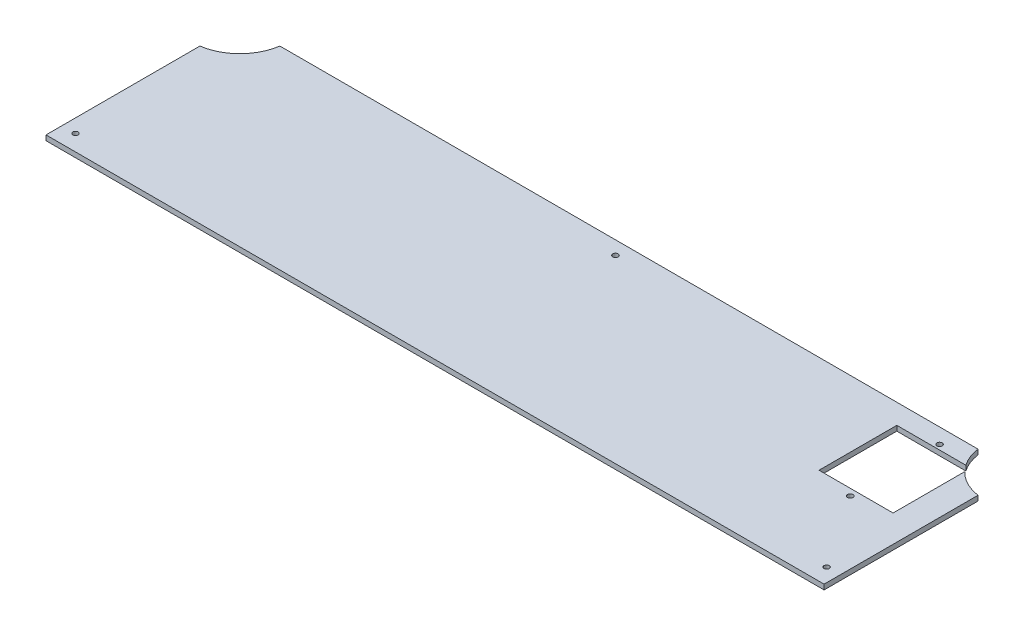
ISO-10303-21;
HEADER;
FILE_DESCRIPTION(('STEP AP214'),'2;1');
FILE_NAME('part.step','',(''),(''),'','','');
FILE_SCHEMA(('AUTOMOTIVE_DESIGN { 1 0 10303 214 1 1 1 1 }'));
ENDSEC;
DATA;
#1=APPLICATION_CONTEXT('core data for automotive mechanical design processes');
#2=APPLICATION_PROTOCOL_DEFINITION('international standard','automotive_design',2000,#1);
#3=PRODUCT_CONTEXT('',#1,'mechanical');
#4=PRODUCT('Part','Part','',(#3));
#5=PRODUCT_RELATED_PRODUCT_CATEGORY('part','',(#4));
#6=PRODUCT_DEFINITION_FORMATION('','',#4);
#7=PRODUCT_DEFINITION_CONTEXT('part definition',#1,'design');
#8=PRODUCT_DEFINITION('design','',#6,#7);
#9=PRODUCT_DEFINITION_SHAPE('','',#8);
#10=(LENGTH_UNIT() NAMED_UNIT(*) SI_UNIT(.MILLI.,.METRE.));
#11=(NAMED_UNIT(*) PLANE_ANGLE_UNIT() SI_UNIT($,.RADIAN.));
#12=(NAMED_UNIT(*) SI_UNIT($,.STERADIAN.) SOLID_ANGLE_UNIT());
#13=UNCERTAINTY_MEASURE_WITH_UNIT(LENGTH_MEASURE(1.E-05),#10,'distance_accuracy_value','');
#14=(GEOMETRIC_REPRESENTATION_CONTEXT(3) GLOBAL_UNCERTAINTY_ASSIGNED_CONTEXT((#13)) GLOBAL_UNIT_ASSIGNED_CONTEXT((#10,
#11,#12)) REPRESENTATION_CONTEXT('',''));
#15=CARTESIAN_POINT('',(0.,0.,0.));
#16=DIRECTION('',(0.,0.,1.));
#17=DIRECTION('',(1.,0.,0.));
#18=AXIS2_PLACEMENT_3D('',#15,#16,#17);
#19=CARTESIAN_POINT('',(-234.652456802082,3.,-62.0635647640357));
#20=DIRECTION('',(0.,1.,0.));
#21=DIRECTION('',(0.,0.,1.));
#22=AXIS2_PLACEMENT_3D('',#19,#20,#21);
#23=PLANE('',#22);
#24=CARTESIAN_POINT('',(0.097543197917882,3.,-50.0635647640358));
#25=DIRECTION('',(0.,1.,0.));
#26=DIRECTION('',(0.,0.,1.));
#27=AXIS2_PLACEMENT_3D('',#24,#25,#26);
#28=CIRCLE('',#27,1.59999999999999);
#29=CARTESIAN_POINT('',(0.097543197917882,3.,-48.4635647640358));
#30=VERTEX_POINT('',#29);
#31=EDGE_CURVE('E413',#30,#30,#28,.T.);
#32=ORIENTED_EDGE('',*,*,#31,.F.);
#33=EDGE_LOOP('',(#32));
#34=FACE_BOUND('',#33,.T.);
#35=CARTESIAN_POINT('',(193.347543197918,3.,-49.0635647640357));
#36=DIRECTION('',(0.,1.,0.));
#37=DIRECTION('',(0.,0.,1.));
#38=AXIS2_PLACEMENT_3D('',#35,#36,#37);
#39=CIRCLE('',#38,1.59999999999996);
#40=CARTESIAN_POINT('',(193.347543197918,3.,-47.4635647640358));
#41=VERTEX_POINT('',#40);
#42=EDGE_CURVE('E425',#41,#41,#39,.T.);
#43=ORIENTED_EDGE('',*,*,#42,.F.);
#44=EDGE_LOOP('',(#43));
#45=FACE_BOUND('',#44,.T.);
#46=DIRECTION('',(0.,0.,-1.));
#47=VECTOR('',#46,1.);
#48=CARTESIAN_POINT('',(230.847543197918,3.,52.6811268702657));
#49=LINE('',#48,#47);
#50=CARTESIAN_POINT('',(230.847543197918,3.,56.9364352359643));
#51=VERTEX_POINT('',#50);
#52=CARTESIAN_POINT('',(230.847543197918,3.,-34.3507518429337));
#53=VERTEX_POINT('',#52);
#54=EDGE_CURVE('E100',#51,#53,#49,.T.);
#55=ORIENTED_EDGE('',*,*,#54,.T.);
#56=CARTESIAN_POINT('',(234.847543197918,3.,-62.0635647640357));
#57=DIRECTION('',(0.,-1.,0.));
#58=DIRECTION('',(0.,0.,1.));
#59=AXIS2_PLACEMENT_3D('',#56,#57,#58);
#60=CIRCLE('',#59,28.);
#61=CARTESIAN_POINT('',(214.772071499805,3.,-42.5449727016391));
#62=VERTEX_POINT('',#61);
#63=EDGE_CURVE('E231',#53,#62,#60,.T.);
#64=ORIENTED_EDGE('',*,*,#63,.T.);
#65=DIRECTION('',(0.,0.,1.));
#66=VECTOR('',#65,1.);
#67=CARTESIAN_POINT('',(214.772071499805,3.,-0.0635647640357256));
#68=LINE('',#67,#66);
#69=CARTESIAN_POINT('',(214.772071499805,3.,-0.0635647640357256));
#70=VERTEX_POINT('',#69);
#71=EDGE_CURVE('E193',#62,#70,#68,.T.);
#72=ORIENTED_EDGE('',*,*,#71,.T.);
#73=DIRECTION('',(-1.,0.,0.));
#74=VECTOR('',#73,1.);
#75=CARTESIAN_POINT('',(170.847543197918,3.,-0.0635647640357395));
#76=LINE('',#75,#74);
#77=CARTESIAN_POINT('',(170.847543197918,3.,-0.0635647640357395));
#78=VERTEX_POINT('',#77);
#79=EDGE_CURVE('E212',#70,#78,#76,.T.);
#80=ORIENTED_EDGE('',*,*,#79,.T.);
#81=DIRECTION('',(0.,0.,-1.));
#82=VECTOR('',#81,1.);
#83=CARTESIAN_POINT('',(170.847543197918,3.,-0.0635647640357395));
#84=LINE('',#83,#82);
#85=CARTESIAN_POINT('',(170.847543197918,3.,-46.1930231524108));
#86=VERTEX_POINT('',#85);
#87=EDGE_CURVE('E209',#78,#86,#84,.T.);
#88=ORIENTED_EDGE('',*,*,#87,.T.);
#89=DIRECTION('',(1.,0.,0.));
#90=VECTOR('',#89,1.);
#91=CARTESIAN_POINT('',(170.847543197918,3.,-46.1930231524108));
#92=LINE('',#91,#90);
#93=CARTESIAN_POINT('',(211.779688747326,3.,-46.1930231524108));
#94=VERTEX_POINT('',#93);
#95=EDGE_CURVE('E211',#86,#94,#92,.T.);
#96=ORIENTED_EDGE('',*,*,#95,.T.);
#97=CARTESIAN_POINT('',(234.847543197918,3.,-62.0635647640357));
#98=DIRECTION('',(0.,-1.,0.));
#99=DIRECTION('',(0.,0.,1.));
#100=AXIS2_PLACEMENT_3D('',#97,#98,#99);
#101=CIRCLE('',#100,28.);
#102=CARTESIAN_POINT('',(207.134730276816,3.,-58.0635647640357));
#103=VERTEX_POINT('',#102);
#104=EDGE_CURVE('E214',#94,#103,#101,.T.);
#105=ORIENTED_EDGE('',*,*,#104,.T.);
#106=DIRECTION('',(-1.,0.,0.));
#107=VECTOR('',#106,1.);
#108=CARTESIAN_POINT('',(207.134730276816,3.,-58.0635647640357));
#109=LINE('',#108,#107);
#110=CARTESIAN_POINT('',(-206.93964388098,3.,-58.0635647640357));
#111=VERTEX_POINT('',#110);
#112=EDGE_CURVE('E129',#103,#111,#109,.T.);
#113=ORIENTED_EDGE('',*,*,#112,.T.);
#114=CARTESIAN_POINT('',(-234.652456802082,3.,-62.0635647640357));
#115=DIRECTION('',(0.,-1.,0.));
#116=DIRECTION('',(0.,0.,1.));
#117=AXIS2_PLACEMENT_3D('',#114,#115,#116);
#118=CIRCLE('',#117,28.);
#119=CARTESIAN_POINT('',(-230.652456802082,3.,-34.3507518429337));
#120=VERTEX_POINT('',#119);
#121=EDGE_CURVE('E123',#111,#120,#118,.T.);
#122=ORIENTED_EDGE('',*,*,#121,.T.);
#123=DIRECTION('',(0.,0.,1.));
#124=VECTOR('',#123,1.);
#125=CARTESIAN_POINT('',(-230.652456802082,3.,-34.3507518429337));
#126=LINE('',#125,#124);
#127=CARTESIAN_POINT('',(-230.652456802082,3.,56.9364352359643));
#128=VERTEX_POINT('',#127);
#129=EDGE_CURVE('E127',#120,#128,#126,.T.);
#130=ORIENTED_EDGE('',*,*,#129,.T.);
#131=DIRECTION('',(1.,0.,0.));
#132=VECTOR('',#131,1.);
#133=CARTESIAN_POINT('',(230.847543197918,3.,56.9364352359643));
#134=LINE('',#133,#132);
#135=EDGE_CURVE('E50',#128,#51,#134,.T.);
#136=ORIENTED_EDGE('',*,*,#135,.T.);
#137=EDGE_LOOP('',(#55,#64,#72,#80,#88,#96,#105,#113,#122,#130,#136));
#138=FACE_BOUND('',#137,.T.);
#139=CARTESIAN_POINT('',(193.347543197918,3.,3.93643523596425));
#140=DIRECTION('',(0.,1.,0.));
#141=DIRECTION('',(0.,0.,1.));
#142=AXIS2_PLACEMENT_3D('',#139,#140,#141);
#143=CIRCLE('',#142,1.59999999999996);
#144=CARTESIAN_POINT('',(193.347543197918,3.,5.53643523596421));
#145=VERTEX_POINT('',#144);
#146=EDGE_CURVE('E150',#145,#145,#143,.T.);
#147=ORIENTED_EDGE('',*,*,#146,.F.);
#148=EDGE_LOOP('',(#147));
#149=FACE_BOUND('',#148,.T.);
#150=CARTESIAN_POINT('',(222.847543197918,3.,47.4364352359643));
#151=DIRECTION('',(0.,1.,0.));
#152=DIRECTION('',(0.,0.,1.));
#153=AXIS2_PLACEMENT_3D('',#150,#151,#152);
#154=CIRCLE('',#153,1.54999999999999);
#155=CARTESIAN_POINT('',(222.847543197918,3.,48.9864352359643));
#156=VERTEX_POINT('',#155);
#157=EDGE_CURVE('E419',#156,#156,#154,.T.);
#158=ORIENTED_EDGE('',*,*,#157,.F.);
#159=EDGE_LOOP('',(#158));
#160=FACE_BOUND('',#159,.T.);
#161=CARTESIAN_POINT('',(-222.652456802082,3.,47.4364352359643));
#162=DIRECTION('',(0.,1.,0.));
#163=DIRECTION('',(0.,0.,1.));
#164=AXIS2_PLACEMENT_3D('',#161,#162,#163);
#165=CIRCLE('',#164,1.54999999999999);
#166=CARTESIAN_POINT('',(-222.652456802082,3.,48.9864352359643));
#167=VERTEX_POINT('',#166);
#168=EDGE_CURVE('E404',#167,#167,#165,.T.);
#169=ORIENTED_EDGE('',*,*,#168,.F.);
#170=EDGE_LOOP('',(#169));
#171=FACE_BOUND('',#170,.T.);
#172=ADVANCED_FACE('F33',(#34,#45,#138,#149,#160,#171),#23,.T.);
#173=CARTESIAN_POINT('',(-234.652456802082,0.,-62.0635647640357));
#174=DIRECTION('',(0.,1.,0.));
#175=DIRECTION('',(0.,0.,1.));
#176=AXIS2_PLACEMENT_3D('',#173,#174,#175);
#177=PLANE('',#176);
#178=DIRECTION('',(0.,0.,-1.));
#179=VECTOR('',#178,1.);
#180=CARTESIAN_POINT('',(230.847543197918,0.,52.6811268702657));
#181=LINE('',#180,#179);
#182=CARTESIAN_POINT('',(230.847543197918,0.,56.9364352359643));
#183=VERTEX_POINT('',#182);
#184=CARTESIAN_POINT('',(230.847543197918,0.,-34.3507518429337));
#185=VERTEX_POINT('',#184);
#186=EDGE_CURVE('E94',#183,#185,#181,.T.);
#187=ORIENTED_EDGE('',*,*,#186,.F.);
#188=DIRECTION('',(1.,0.,0.));
#189=VECTOR('',#188,1.);
#190=CARTESIAN_POINT('',(230.847543197918,0.,56.9364352359643));
#191=LINE('',#190,#189);
#192=CARTESIAN_POINT('',(-230.652456802082,0.,56.9364352359643));
#193=VERTEX_POINT('',#192);
#194=EDGE_CURVE('E166',#193,#183,#191,.T.);
#195=ORIENTED_EDGE('',*,*,#194,.F.);
#196=DIRECTION('',(0.,0.,1.));
#197=VECTOR('',#196,1.);
#198=CARTESIAN_POINT('',(-230.652456802082,0.,56.9364352359643));
#199=LINE('',#198,#197);
#200=CARTESIAN_POINT('',(-230.652456802082,0.,-34.3507518429337));
#201=VERTEX_POINT('',#200);
#202=EDGE_CURVE('E87',#201,#193,#199,.T.);
#203=ORIENTED_EDGE('',*,*,#202,.F.);
#204=CARTESIAN_POINT('',(-234.652456802082,0.,-62.0635647640357));
#205=DIRECTION('',(0.,-1.,0.));
#206=DIRECTION('',(0.,0.,1.));
#207=AXIS2_PLACEMENT_3D('',#204,#205,#206);
#208=CIRCLE('',#207,28.);
#209=CARTESIAN_POINT('',(-206.93964388098,0.,-58.0635647640357));
#210=VERTEX_POINT('',#209);
#211=EDGE_CURVE('E138',#210,#201,#208,.T.);
#212=ORIENTED_EDGE('',*,*,#211,.F.);
#213=DIRECTION('',(-1.,0.,0.));
#214=VECTOR('',#213,1.);
#215=CARTESIAN_POINT('',(207.134730276816,0.,-58.0635647640357));
#216=LINE('',#215,#214);
#217=CARTESIAN_POINT('',(207.134730276816,0.,-58.0635647640357));
#218=VERTEX_POINT('',#217);
#219=EDGE_CURVE('E162',#218,#210,#216,.T.);
#220=ORIENTED_EDGE('',*,*,#219,.F.);
#221=CARTESIAN_POINT('',(234.847543197918,0.,-62.0635647640357));
#222=DIRECTION('',(0.,-1.,0.));
#223=DIRECTION('',(0.,0.,1.));
#224=AXIS2_PLACEMENT_3D('',#221,#222,#223);
#225=CIRCLE('',#224,28.);
#226=CARTESIAN_POINT('',(211.779688747326,0.,-46.1930231524108));
#227=VERTEX_POINT('',#226);
#228=EDGE_CURVE('E160',#227,#218,#225,.T.);
#229=ORIENTED_EDGE('',*,*,#228,.F.);
#230=DIRECTION('',(1.,0.,0.));
#231=VECTOR('',#230,1.);
#232=CARTESIAN_POINT('',(170.847543197918,0.,-46.1930231524108));
#233=LINE('',#232,#231);
#234=CARTESIAN_POINT('',(170.847543197918,0.,-46.1930231524108));
#235=VERTEX_POINT('',#234);
#236=EDGE_CURVE('E158',#235,#227,#233,.T.);
#237=ORIENTED_EDGE('',*,*,#236,.F.);
#238=DIRECTION('',(0.,0.,-1.));
#239=VECTOR('',#238,1.);
#240=CARTESIAN_POINT('',(170.847543197918,0.,-0.0635647640357395));
#241=LINE('',#240,#239);
#242=CARTESIAN_POINT('',(170.847543197918,0.,-0.0635647640357395));
#243=VERTEX_POINT('',#242);
#244=EDGE_CURVE('E156',#243,#235,#241,.T.);
#245=ORIENTED_EDGE('',*,*,#244,.F.);
#246=DIRECTION('',(-1.,0.,0.));
#247=VECTOR('',#246,1.);
#248=CARTESIAN_POINT('',(170.847543197918,0.,-0.0635647640357395));
#249=LINE('',#248,#247);
#250=CARTESIAN_POINT('',(214.772071499805,0.,-0.0635647640357256));
#251=VERTEX_POINT('',#250);
#252=EDGE_CURVE('E154',#251,#243,#249,.T.);
#253=ORIENTED_EDGE('',*,*,#252,.F.);
#254=DIRECTION('',(0.,0.,1.));
#255=VECTOR('',#254,1.);
#256=CARTESIAN_POINT('',(214.772071499805,0.,-0.0635647640357256));
#257=LINE('',#256,#255);
#258=CARTESIAN_POINT('',(214.772071499805,0.,-42.5449727016391));
#259=VERTEX_POINT('',#258);
#260=EDGE_CURVE('E152',#259,#251,#257,.T.);
#261=ORIENTED_EDGE('',*,*,#260,.F.);
#262=CARTESIAN_POINT('',(234.847543197918,0.,-62.0635647640357));
#263=DIRECTION('',(0.,-1.,0.));
#264=DIRECTION('',(0.,0.,1.));
#265=AXIS2_PLACEMENT_3D('',#262,#263,#264);
#266=CIRCLE('',#265,28.);
#267=EDGE_CURVE('E149',#185,#259,#266,.T.);
#268=ORIENTED_EDGE('',*,*,#267,.F.);
#269=EDGE_LOOP('',(#187,#195,#203,#212,#220,#229,#237,#245,#253,#261,#268));
#270=FACE_BOUND('',#269,.T.);
#271=CARTESIAN_POINT('',(193.347543197918,0.,3.93643523596425));
#272=DIRECTION('',(0.,1.,0.));
#273=DIRECTION('',(0.,0.,1.));
#274=AXIS2_PLACEMENT_3D('',#271,#272,#273);
#275=CIRCLE('',#274,1.59999999999996);
#276=CARTESIAN_POINT('',(193.347543197918,0.,5.53643523596421));
#277=VERTEX_POINT('',#276);
#278=EDGE_CURVE('E235',#277,#277,#275,.T.);
#279=ORIENTED_EDGE('',*,*,#278,.T.);
#280=EDGE_LOOP('',(#279));
#281=FACE_BOUND('',#280,.T.);
#282=CARTESIAN_POINT('',(193.347543197918,0.,-49.0635647640357));
#283=DIRECTION('',(0.,1.,0.));
#284=DIRECTION('',(0.,0.,1.));
#285=AXIS2_PLACEMENT_3D('',#282,#283,#284);
#286=CIRCLE('',#285,1.59999999999996);
#287=CARTESIAN_POINT('',(193.347543197918,0.,-47.4635647640358));
#288=VERTEX_POINT('',#287);
#289=EDGE_CURVE('E422',#288,#288,#286,.T.);
#290=ORIENTED_EDGE('',*,*,#289,.T.);
#291=EDGE_LOOP('',(#290));
#292=FACE_BOUND('',#291,.T.);
#293=CARTESIAN_POINT('',(222.847543197918,0.,47.4364352359643));
#294=DIRECTION('',(0.,1.,0.));
#295=DIRECTION('',(0.,0.,1.));
#296=AXIS2_PLACEMENT_3D('',#293,#294,#295);
#297=CIRCLE('',#296,1.54999999999999);
#298=CARTESIAN_POINT('',(222.847543197918,0.,48.9864352359643));
#299=VERTEX_POINT('',#298);
#300=EDGE_CURVE('E416',#299,#299,#297,.T.);
#301=ORIENTED_EDGE('',*,*,#300,.T.);
#302=EDGE_LOOP('',(#301));
#303=FACE_BOUND('',#302,.T.);
#304=CARTESIAN_POINT('',(0.097543197917882,0.,-50.0635647640358));
#305=DIRECTION('',(0.,1.,0.));
#306=DIRECTION('',(0.,0.,1.));
#307=AXIS2_PLACEMENT_3D('',#304,#305,#306);
#308=CIRCLE('',#307,1.59999999999999);
#309=CARTESIAN_POINT('',(0.097543197917882,0.,-48.4635647640358));
#310=VERTEX_POINT('',#309);
#311=EDGE_CURVE('E410',#310,#310,#308,.T.);
#312=ORIENTED_EDGE('',*,*,#311,.T.);
#313=EDGE_LOOP('',(#312));
#314=FACE_BOUND('',#313,.T.);
#315=CARTESIAN_POINT('',(-222.652456802082,0.,47.4364352359643));
#316=DIRECTION('',(0.,1.,0.));
#317=DIRECTION('',(0.,0.,1.));
#318=AXIS2_PLACEMENT_3D('',#315,#316,#317);
#319=CIRCLE('',#318,1.54999999999999);
#320=CARTESIAN_POINT('',(-222.652456802082,0.,48.9864352359643));
#321=VERTEX_POINT('',#320);
#322=EDGE_CURVE('E407',#321,#321,#319,.T.);
#323=ORIENTED_EDGE('',*,*,#322,.T.);
#324=EDGE_LOOP('',(#323));
#325=FACE_BOUND('',#324,.T.);
#326=ADVANCED_FACE('F197',(#270,#281,#292,#303,#314,#325),#177,.F.);
#327=CARTESIAN_POINT('',(230.847543197918,3.,52.6811268702657));
#328=DIRECTION('',(-1.,0.,0.));
#329=DIRECTION('',(0.,0.,1.));
#330=AXIS2_PLACEMENT_3D('',#327,#328,#329);
#331=PLANE('',#330);
#332=ORIENTED_EDGE('',*,*,#186,.T.);
#333=DIRECTION('',(0.,-1.,0.));
#334=VECTOR('',#333,1.);
#335=CARTESIAN_POINT('',(230.847543197918,3.,-34.3507518429337));
#336=LINE('',#335,#334);
#337=EDGE_CURVE('E11',#53,#185,#336,.T.);
#338=ORIENTED_EDGE('',*,*,#337,.F.);
#339=ORIENTED_EDGE('',*,*,#54,.F.);
#340=DIRECTION('',(0.,-1.,0.));
#341=VECTOR('',#340,1.);
#342=CARTESIAN_POINT('',(230.847543197918,3.,56.9364352359643));
#343=LINE('',#342,#341);
#344=EDGE_CURVE('E144',#51,#183,#343,.T.);
#345=ORIENTED_EDGE('',*,*,#344,.T.);
#346=EDGE_LOOP('',(#332,#338,#339,#345));
#347=FACE_BOUND('',#346,.T.);
#348=ADVANCED_FACE('F35',(#347),#331,.F.);
#349=CARTESIAN_POINT('',(234.847543197918,3.,-62.0635647640357));
#350=DIRECTION('',(0.,-1.,0.));
#351=DIRECTION('',(0.,0.,-1.));
#352=AXIS2_PLACEMENT_3D('',#349,#350,#351);
#353=CYLINDRICAL_SURFACE('',#352,28.);
#354=ORIENTED_EDGE('',*,*,#267,.T.);
#355=DIRECTION('',(0.,-1.,0.));
#356=VECTOR('',#355,1.);
#357=CARTESIAN_POINT('',(214.772071499805,3.,-42.5449727016391));
#358=LINE('',#357,#356);
#359=EDGE_CURVE('E42',#62,#259,#358,.T.);
#360=ORIENTED_EDGE('',*,*,#359,.F.);
#361=ORIENTED_EDGE('',*,*,#63,.F.);
#362=ORIENTED_EDGE('',*,*,#337,.T.);
#363=EDGE_LOOP('',(#354,#360,#361,#362));
#364=FACE_BOUND('',#363,.T.);
#365=ADVANCED_FACE('F237',(#364),#353,.F.);
#366=CARTESIAN_POINT('',(214.772071499805,3.,-0.0635647640357256));
#367=DIRECTION('',(1.,0.,0.));
#368=DIRECTION('',(0.,0.,-1.));
#369=AXIS2_PLACEMENT_3D('',#366,#367,#368);
#370=PLANE('',#369);
#371=ORIENTED_EDGE('',*,*,#260,.T.);
#372=DIRECTION('',(0.,-1.,0.));
#373=VECTOR('',#372,1.);
#374=CARTESIAN_POINT('',(214.772071499805,3.,-0.0635647640357256));
#375=LINE('',#374,#373);
#376=EDGE_CURVE('E184',#70,#251,#375,.T.);
#377=ORIENTED_EDGE('',*,*,#376,.F.);
#378=ORIENTED_EDGE('',*,*,#71,.F.);
#379=ORIENTED_EDGE('',*,*,#359,.T.);
#380=EDGE_LOOP('',(#371,#377,#378,#379));
#381=FACE_BOUND('',#380,.T.);
#382=ADVANCED_FACE('F191',(#381),#370,.F.);
#383=CARTESIAN_POINT('',(170.847543197918,3.,-0.0635647640357395));
#384=DIRECTION('',(0.,0.,1.));
#385=DIRECTION('',(1.,0.,0.));
#386=AXIS2_PLACEMENT_3D('',#383,#384,#385);
#387=PLANE('',#386);
#388=ORIENTED_EDGE('',*,*,#252,.T.);
#389=DIRECTION('',(0.,-1.,0.));
#390=VECTOR('',#389,1.);
#391=CARTESIAN_POINT('',(170.847543197918,3.,-0.0635647640357395));
#392=LINE('',#391,#390);
#393=EDGE_CURVE('E181',#78,#243,#392,.T.);
#394=ORIENTED_EDGE('',*,*,#393,.F.);
#395=ORIENTED_EDGE('',*,*,#79,.F.);
#396=ORIENTED_EDGE('',*,*,#376,.T.);
#397=EDGE_LOOP('',(#388,#394,#395,#396));
#398=FACE_BOUND('',#397,.T.);
#399=ADVANCED_FACE('F203',(#398),#387,.F.);
#400=CARTESIAN_POINT('',(170.847543197918,3.,-0.0635647640357395));
#401=DIRECTION('',(-1.,0.,0.));
#402=DIRECTION('',(0.,0.,1.));
#403=AXIS2_PLACEMENT_3D('',#400,#401,#402);
#404=PLANE('',#403);
#405=ORIENTED_EDGE('',*,*,#244,.T.);
#406=DIRECTION('',(0.,-1.,0.));
#407=VECTOR('',#406,1.);
#408=CARTESIAN_POINT('',(170.847543197918,3.,-46.1930231524108));
#409=LINE('',#408,#407);
#410=EDGE_CURVE('E178',#86,#235,#409,.T.);
#411=ORIENTED_EDGE('',*,*,#410,.F.);
#412=ORIENTED_EDGE('',*,*,#87,.F.);
#413=ORIENTED_EDGE('',*,*,#393,.T.);
#414=EDGE_LOOP('',(#405,#411,#412,#413));
#415=FACE_BOUND('',#414,.T.);
#416=ADVANCED_FACE('F207',(#415),#404,.F.);
#417=CARTESIAN_POINT('',(170.847543197918,3.,-46.1930231524108));
#418=DIRECTION('',(0.,0.,-1.));
#419=DIRECTION('',(-1.,0.,0.));
#420=AXIS2_PLACEMENT_3D('',#417,#418,#419);
#421=PLANE('',#420);
#422=ORIENTED_EDGE('',*,*,#236,.T.);
#423=DIRECTION('',(0.,-1.,0.));
#424=VECTOR('',#423,1.);
#425=CARTESIAN_POINT('',(211.779688747326,3.,-46.1930231524108));
#426=LINE('',#425,#424);
#427=EDGE_CURVE('E175',#94,#227,#426,.T.);
#428=ORIENTED_EDGE('',*,*,#427,.F.);
#429=ORIENTED_EDGE('',*,*,#95,.F.);
#430=ORIENTED_EDGE('',*,*,#410,.T.);
#431=EDGE_LOOP('',(#422,#428,#429,#430));
#432=FACE_BOUND('',#431,.T.);
#433=ADVANCED_FACE('F267',(#432),#421,.F.);
#434=CARTESIAN_POINT('',(234.847543197918,3.,-62.0635647640357));
#435=DIRECTION('',(0.,-1.,0.));
#436=DIRECTION('',(0.,0.,-1.));
#437=AXIS2_PLACEMENT_3D('',#434,#435,#436);
#438=CYLINDRICAL_SURFACE('',#437,28.);
#439=ORIENTED_EDGE('',*,*,#228,.T.);
#440=DIRECTION('',(0.,-1.,0.));
#441=VECTOR('',#440,1.);
#442=CARTESIAN_POINT('',(207.134730276816,3.,-58.0635647640357));
#443=LINE('',#442,#441);
#444=EDGE_CURVE('E172',#103,#218,#443,.T.);
#445=ORIENTED_EDGE('',*,*,#444,.F.);
#446=ORIENTED_EDGE('',*,*,#104,.F.);
#447=ORIENTED_EDGE('',*,*,#427,.T.);
#448=EDGE_LOOP('',(#439,#445,#446,#447));
#449=FACE_BOUND('',#448,.T.);
#450=ADVANCED_FACE('F223',(#449),#438,.F.);
#451=CARTESIAN_POINT('',(207.134730276816,3.,-58.0635647640357));
#452=DIRECTION('',(0.,0.,1.));
#453=DIRECTION('',(1.,0.,0.));
#454=AXIS2_PLACEMENT_3D('',#451,#452,#453);
#455=PLANE('',#454);
#456=ORIENTED_EDGE('',*,*,#219,.T.);
#457=DIRECTION('',(0.,-1.,0.));
#458=VECTOR('',#457,1.);
#459=CARTESIAN_POINT('',(-206.93964388098,3.,-58.0635647640357));
#460=LINE('',#459,#458);
#461=EDGE_CURVE('E139',#111,#210,#460,.T.);
#462=ORIENTED_EDGE('',*,*,#461,.F.);
#463=ORIENTED_EDGE('',*,*,#112,.F.);
#464=ORIENTED_EDGE('',*,*,#444,.T.);
#465=EDGE_LOOP('',(#456,#462,#463,#464));
#466=FACE_BOUND('',#465,.T.);
#467=ADVANCED_FACE('F227',(#466),#455,.F.);
#468=CARTESIAN_POINT('',(-234.652456802082,3.,-62.0635647640357));
#469=DIRECTION('',(0.,-1.,0.));
#470=DIRECTION('',(0.,0.,-1.));
#471=AXIS2_PLACEMENT_3D('',#468,#469,#470);
#472=CYLINDRICAL_SURFACE('',#471,28.);
#473=ORIENTED_EDGE('',*,*,#211,.T.);
#474=DIRECTION('',(0.,-1.,0.));
#475=VECTOR('',#474,1.);
#476=CARTESIAN_POINT('',(-230.652456802082,3.,-34.3507518429337));
#477=LINE('',#476,#475);
#478=EDGE_CURVE('E135',#120,#201,#477,.T.);
#479=ORIENTED_EDGE('',*,*,#478,.F.);
#480=ORIENTED_EDGE('',*,*,#121,.F.);
#481=ORIENTED_EDGE('',*,*,#461,.T.);
#482=EDGE_LOOP('',(#473,#479,#480,#481));
#483=FACE_BOUND('',#482,.T.);
#484=ADVANCED_FACE('F136',(#483),#472,.F.);
#485=CARTESIAN_POINT('',(-230.652456802082,3.,56.9364352359643));
#486=DIRECTION('',(1.,0.,0.));
#487=DIRECTION('',(0.,0.,-1.));
#488=AXIS2_PLACEMENT_3D('',#485,#486,#487);
#489=PLANE('',#488);
#490=ORIENTED_EDGE('',*,*,#202,.T.);
#491=DIRECTION('',(0.,-1.,0.));
#492=VECTOR('',#491,1.);
#493=CARTESIAN_POINT('',(-230.652456802082,3.,56.9364352359643));
#494=LINE('',#493,#492);
#495=EDGE_CURVE('E140',#128,#193,#494,.T.);
#496=ORIENTED_EDGE('',*,*,#495,.F.);
#497=ORIENTED_EDGE('',*,*,#129,.F.);
#498=ORIENTED_EDGE('',*,*,#478,.T.);
#499=EDGE_LOOP('',(#490,#496,#497,#498));
#500=FACE_BOUND('',#499,.T.);
#501=ADVANCED_FACE('F142',(#500),#489,.F.);
#502=CARTESIAN_POINT('',(230.847543197918,3.,56.9364352359643));
#503=DIRECTION('',(0.,0.,-1.));
#504=DIRECTION('',(-1.,0.,0.));
#505=AXIS2_PLACEMENT_3D('',#502,#503,#504);
#506=PLANE('',#505);
#507=ORIENTED_EDGE('',*,*,#194,.T.);
#508=ORIENTED_EDGE('',*,*,#344,.F.);
#509=ORIENTED_EDGE('',*,*,#135,.F.);
#510=ORIENTED_EDGE('',*,*,#495,.T.);
#511=EDGE_LOOP('',(#507,#508,#509,#510));
#512=FACE_BOUND('',#511,.T.);
#513=ADVANCED_FACE('F229',(#512),#506,.F.);
#514=CARTESIAN_POINT('',(193.347543197918,3.,3.93643523596425));
#515=DIRECTION('',(0.,-1.,0.));
#516=DIRECTION('',(0.,0.,-1.));
#517=AXIS2_PLACEMENT_3D('',#514,#515,#516);
#518=CYLINDRICAL_SURFACE('',#517,1.59999999999996);
#519=ORIENTED_EDGE('',*,*,#146,.T.);
#520=EDGE_LOOP('',(#519));
#521=FACE_BOUND('',#520,.T.);
#522=ORIENTED_EDGE('',*,*,#278,.F.);
#523=EDGE_LOOP('',(#522));
#524=FACE_BOUND('',#523,.T.);
#525=ADVANCED_FACE('F254',(#521,#524),#518,.F.);
#526=CARTESIAN_POINT('',(193.347543197918,3.,-49.0635647640357));
#527=DIRECTION('',(0.,-1.,0.));
#528=DIRECTION('',(0.,0.,-1.));
#529=AXIS2_PLACEMENT_3D('',#526,#527,#528);
#530=CYLINDRICAL_SURFACE('',#529,1.59999999999996);
#531=ORIENTED_EDGE('',*,*,#42,.T.);
#532=EDGE_LOOP('',(#531));
#533=FACE_BOUND('',#532,.T.);
#534=ORIENTED_EDGE('',*,*,#289,.F.);
#535=EDGE_LOOP('',(#534));
#536=FACE_BOUND('',#535,.T.);
#537=ADVANCED_FACE('F312',(#533,#536),#530,.F.);
#538=CARTESIAN_POINT('',(222.847543197918,3.,47.4364352359643));
#539=DIRECTION('',(0.,-1.,0.));
#540=DIRECTION('',(0.,0.,-1.));
#541=AXIS2_PLACEMENT_3D('',#538,#539,#540);
#542=CYLINDRICAL_SURFACE('',#541,1.54999999999999);
#543=ORIENTED_EDGE('',*,*,#157,.T.);
#544=EDGE_LOOP('',(#543));
#545=FACE_BOUND('',#544,.T.);
#546=ORIENTED_EDGE('',*,*,#300,.F.);
#547=EDGE_LOOP('',(#546));
#548=FACE_BOUND('',#547,.T.);
#549=ADVANCED_FACE('F319',(#545,#548),#542,.F.);
#550=CARTESIAN_POINT('',(0.097543197917882,3.,-50.0635647640358));
#551=DIRECTION('',(0.,-1.,0.));
#552=DIRECTION('',(0.,0.,-1.));
#553=AXIS2_PLACEMENT_3D('',#550,#551,#552);
#554=CYLINDRICAL_SURFACE('',#553,1.59999999999999);
#555=ORIENTED_EDGE('',*,*,#31,.T.);
#556=EDGE_LOOP('',(#555));
#557=FACE_BOUND('',#556,.T.);
#558=ORIENTED_EDGE('',*,*,#311,.F.);
#559=EDGE_LOOP('',(#558));
#560=FACE_BOUND('',#559,.T.);
#561=ADVANCED_FACE('F326',(#557,#560),#554,.F.);
#562=CARTESIAN_POINT('',(-222.652456802082,3.,47.4364352359643));
#563=DIRECTION('',(0.,-1.,0.));
#564=DIRECTION('',(0.,0.,-1.));
#565=AXIS2_PLACEMENT_3D('',#562,#563,#564);
#566=CYLINDRICAL_SURFACE('',#565,1.54999999999999);
#567=ORIENTED_EDGE('',*,*,#168,.T.);
#568=EDGE_LOOP('',(#567));
#569=FACE_BOUND('',#568,.T.);
#570=ORIENTED_EDGE('',*,*,#322,.F.);
#571=EDGE_LOOP('',(#570));
#572=FACE_BOUND('',#571,.T.);
#573=ADVANCED_FACE('F334',(#569,#572),#566,.F.);
#574=CLOSED_SHELL('',(#172,#326,#348,#365,#382,#399,#416,#433,#450,#467,#484,#501,#513,#525,
#537,#549,#561,#573));
#575=MANIFOLD_SOLID_BREP('B2',#574);
#576=ADVANCED_BREP_SHAPE_REPRESENTATION('',(#18,#575),#14);
#577=SHAPE_DEFINITION_REPRESENTATION(#9,#576);
ENDSEC;
END-ISO-10303-21;
